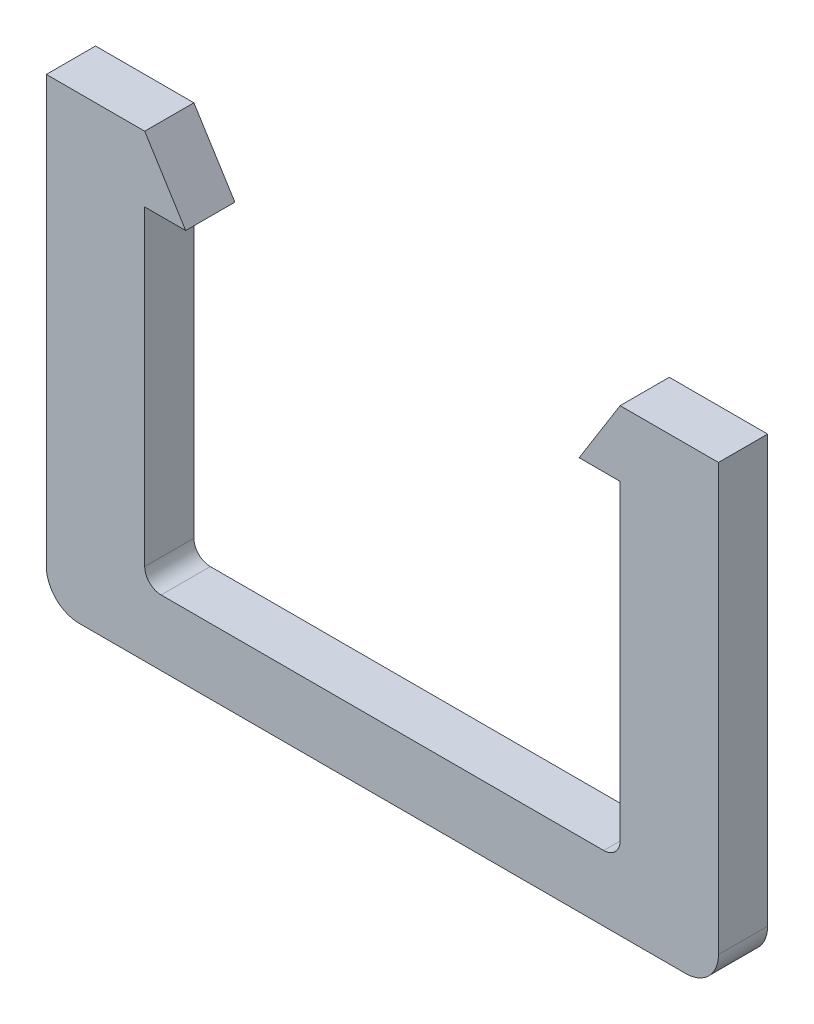
ISO-10303-21;
HEADER;
FILE_DESCRIPTION(('STEP AP214'),'2;1');
FILE_NAME('part.step','',(''),(''),'','','');
FILE_SCHEMA(('AUTOMOTIVE_DESIGN { 1 0 10303 214 1 1 1 1 }'));
ENDSEC;
DATA;
#1=APPLICATION_CONTEXT('core data for automotive mechanical design processes');
#2=APPLICATION_PROTOCOL_DEFINITION('international standard','automotive_design',2000,#1);
#3=PRODUCT_CONTEXT('',#1,'mechanical');
#4=PRODUCT('Part','Part','',(#3));
#5=PRODUCT_RELATED_PRODUCT_CATEGORY('part','',(#4));
#6=PRODUCT_DEFINITION_FORMATION('','',#4);
#7=PRODUCT_DEFINITION_CONTEXT('part definition',#1,'design');
#8=PRODUCT_DEFINITION('design','',#6,#7);
#9=PRODUCT_DEFINITION_SHAPE('','',#8);
#10=(LENGTH_UNIT() NAMED_UNIT(*) SI_UNIT(.MILLI.,.METRE.));
#11=(NAMED_UNIT(*) PLANE_ANGLE_UNIT() SI_UNIT($,.RADIAN.));
#12=(NAMED_UNIT(*) SI_UNIT($,.STERADIAN.) SOLID_ANGLE_UNIT());
#13=UNCERTAINTY_MEASURE_WITH_UNIT(LENGTH_MEASURE(1.E-05),#10,'distance_accuracy_value','');
#14=(GEOMETRIC_REPRESENTATION_CONTEXT(3) GLOBAL_UNCERTAINTY_ASSIGNED_CONTEXT((#13)) GLOBAL_UNIT_ASSIGNED_CONTEXT((#10,
#11,#12)) REPRESENTATION_CONTEXT('',''));
#15=CARTESIAN_POINT('',(0.,0.,0.));
#16=DIRECTION('',(0.,0.,1.));
#17=DIRECTION('',(1.,0.,0.));
#18=AXIS2_PLACEMENT_3D('',#15,#16,#17);
#19=CARTESIAN_POINT('',(-14.5,24.,1.5));
#20=DIRECTION('',(0.,1.,0.));
#21=DIRECTION('',(-1.,0.,0.));
#22=AXIS2_PLACEMENT_3D('',#19,#20,#21);
#23=PLANE('',#22);
#24=DIRECTION('',(1.,0.,0.));
#25=VECTOR('',#24,1.);
#26=CARTESIAN_POINT('',(-14.5,24.,-1.5));
#27=LINE('',#26,#25);
#28=CARTESIAN_POINT('',(-14.5,24.,-1.5));
#29=VERTEX_POINT('',#28);
#30=CARTESIAN_POINT('',(-12.,24.,-1.5));
#31=VERTEX_POINT('',#30);
#32=EDGE_CURVE('E188',#29,#31,#27,.T.);
#33=ORIENTED_EDGE('',*,*,#32,.T.);
#34=DIRECTION('',(0.,0.,-1.));
#35=VECTOR('',#34,1.);
#36=CARTESIAN_POINT('',(-12.,24.,1.5));
#37=LINE('',#36,#35);
#38=CARTESIAN_POINT('',(-12.,24.,1.5));
#39=VERTEX_POINT('',#38);
#40=EDGE_CURVE('E11',#39,#31,#37,.T.);
#41=ORIENTED_EDGE('',*,*,#40,.F.);
#42=DIRECTION('',(1.,0.,0.));
#43=VECTOR('',#42,1.);
#44=CARTESIAN_POINT('',(-14.5,24.,1.5));
#45=LINE('',#44,#43);
#46=CARTESIAN_POINT('',(-14.5,24.,1.5));
#47=VERTEX_POINT('',#46);
#48=EDGE_CURVE('E234',#47,#39,#45,.T.);
#49=ORIENTED_EDGE('',*,*,#48,.F.);
#50=DIRECTION('',(0.,0.,-1.));
#51=VECTOR('',#50,1.);
#52=CARTESIAN_POINT('',(-14.5,24.,1.5));
#53=LINE('',#52,#51);
#54=EDGE_CURVE('E184',#47,#29,#53,.T.);
#55=ORIENTED_EDGE('',*,*,#54,.T.);
#56=EDGE_LOOP('',(#33,#41,#49,#55));
#57=FACE_BOUND('',#56,.T.);
#58=ADVANCED_FACE('F39',(#57),#23,.F.);
#59=CARTESIAN_POINT('',(-14.5,28.,1.5));
#60=DIRECTION('',(-0.847998304005089,-0.529998940003179,0.));
#61=DIRECTION('',(0.529998940003179,-0.847998304005089,0.));
#62=AXIS2_PLACEMENT_3D('',#59,#60,#61);
#63=PLANE('',#62);
#64=DIRECTION('',(-0.529998940003179,0.847998304005089,0.));
#65=VECTOR('',#64,1.);
#66=CARTESIAN_POINT('',(-14.5,28.,-1.5));
#67=LINE('',#66,#65);
#68=CARTESIAN_POINT('',(-14.5,28.,-1.5));
#69=VERTEX_POINT('',#68);
#70=EDGE_CURVE('E192',#31,#69,#67,.T.);
#71=ORIENTED_EDGE('',*,*,#70,.T.);
#72=DIRECTION('',(0.,0.,-1.));
#73=VECTOR('',#72,1.);
#74=CARTESIAN_POINT('',(-14.5,28.,1.5));
#75=LINE('',#74,#73);
#76=CARTESIAN_POINT('',(-14.5,28.,1.5));
#77=VERTEX_POINT('',#76);
#78=EDGE_CURVE('E48',#77,#69,#75,.T.);
#79=ORIENTED_EDGE('',*,*,#78,.F.);
#80=DIRECTION('',(-0.529998940003179,0.847998304005089,0.));
#81=VECTOR('',#80,1.);
#82=CARTESIAN_POINT('',(-14.5,28.,1.5));
#83=LINE('',#82,#81);
#84=EDGE_CURVE('E123',#39,#77,#83,.T.);
#85=ORIENTED_EDGE('',*,*,#84,.F.);
#86=ORIENTED_EDGE('',*,*,#40,.T.);
#87=EDGE_LOOP('',(#71,#79,#85,#86));
#88=FACE_BOUND('',#87,.T.);
#89=ADVANCED_FACE('F356',(#88),#63,.F.);
#90=CARTESIAN_POINT('',(-20.5,28.,1.5));
#91=DIRECTION('',(0.,-1.,0.));
#92=DIRECTION('',(1.,0.,0.));
#93=AXIS2_PLACEMENT_3D('',#90,#91,#92);
#94=PLANE('',#93);
#95=DIRECTION('',(-1.,0.,0.));
#96=VECTOR('',#95,1.);
#97=CARTESIAN_POINT('',(-20.5,28.,-1.5));
#98=LINE('',#97,#96);
#99=CARTESIAN_POINT('',(-20.5,28.,-1.5));
#100=VERTEX_POINT('',#99);
#101=EDGE_CURVE('E195',#69,#100,#98,.T.);
#102=ORIENTED_EDGE('',*,*,#101,.T.);
#103=DIRECTION('',(0.,0.,-1.));
#104=VECTOR('',#103,1.);
#105=CARTESIAN_POINT('',(-20.5,28.,1.5));
#106=LINE('',#105,#104);
#107=CARTESIAN_POINT('',(-20.5,28.,1.5));
#108=VERTEX_POINT('',#107);
#109=EDGE_CURVE('E277',#108,#100,#106,.T.);
#110=ORIENTED_EDGE('',*,*,#109,.F.);
#111=DIRECTION('',(-1.,0.,0.));
#112=VECTOR('',#111,1.);
#113=CARTESIAN_POINT('',(-20.5,28.,1.5));
#114=LINE('',#113,#112);
#115=EDGE_CURVE('E287',#77,#108,#114,.T.);
#116=ORIENTED_EDGE('',*,*,#115,.F.);
#117=ORIENTED_EDGE('',*,*,#78,.T.);
#118=EDGE_LOOP('',(#102,#110,#116,#117));
#119=FACE_BOUND('',#118,.T.);
#120=ADVANCED_FACE('F285',(#119),#94,.F.);
#121=CARTESIAN_POINT('',(-20.5,2.00000000000001,1.5));
#122=DIRECTION('',(1.,0.,0.));
#123=DIRECTION('',(0.,0.,-1.));
#124=AXIS2_PLACEMENT_3D('',#121,#122,#123);
#125=PLANE('',#124);
#126=DIRECTION('',(0.,-1.,0.));
#127=VECTOR('',#126,1.);
#128=CARTESIAN_POINT('',(-20.5,2.00000000000001,-1.5));
#129=LINE('',#128,#127);
#130=CARTESIAN_POINT('',(-20.5,2.,-1.5));
#131=VERTEX_POINT('',#130);
#132=EDGE_CURVE('E198',#100,#131,#129,.T.);
#133=ORIENTED_EDGE('',*,*,#132,.T.);
#134=DIRECTION('',(0.,0.,-1.));
#135=VECTOR('',#134,1.);
#136=CARTESIAN_POINT('',(-20.5,2.,1.5));
#137=LINE('',#136,#135);
#138=CARTESIAN_POINT('',(-20.5,2.,1.5));
#139=VERTEX_POINT('',#138);
#140=EDGE_CURVE('E273',#139,#131,#137,.T.);
#141=ORIENTED_EDGE('',*,*,#140,.F.);
#142=DIRECTION('',(0.,-1.,0.));
#143=VECTOR('',#142,1.);
#144=CARTESIAN_POINT('',(-20.5,2.00000000000001,1.5));
#145=LINE('',#144,#143);
#146=EDGE_CURVE('E306',#108,#139,#145,.T.);
#147=ORIENTED_EDGE('',*,*,#146,.F.);
#148=ORIENTED_EDGE('',*,*,#109,.T.);
#149=EDGE_LOOP('',(#133,#141,#147,#148));
#150=FACE_BOUND('',#149,.T.);
#151=ADVANCED_FACE('F296',(#150),#125,.F.);
#152=CARTESIAN_POINT('',(-18.5,2.,1.5));
#153=DIRECTION('',(0.,0.,-1.));
#154=DIRECTION('',(-1.,0.,0.));
#155=AXIS2_PLACEMENT_3D('',#152,#153,#154);
#156=CYLINDRICAL_SURFACE('',#155,2.);
#157=CARTESIAN_POINT('',(-18.5,2.,-1.5));
#158=DIRECTION('',(0.,0.,1.));
#159=DIRECTION('',(-1.,0.,0.));
#160=AXIS2_PLACEMENT_3D('',#157,#158,#159);
#161=CIRCLE('',#160,2.);
#162=CARTESIAN_POINT('',(-18.5,0.,-1.5));
#163=VERTEX_POINT('',#162);
#164=EDGE_CURVE('E201',#131,#163,#161,.T.);
#165=ORIENTED_EDGE('',*,*,#164,.T.);
#166=DIRECTION('',(0.,0.,-1.));
#167=VECTOR('',#166,1.);
#168=CARTESIAN_POINT('',(-18.5,0.,1.5));
#169=LINE('',#168,#167);
#170=CARTESIAN_POINT('',(-18.5,0.,1.5));
#171=VERTEX_POINT('',#170);
#172=EDGE_CURVE('E269',#171,#163,#169,.T.);
#173=ORIENTED_EDGE('',*,*,#172,.F.);
#174=CARTESIAN_POINT('',(-18.5,2.,1.5));
#175=DIRECTION('',(0.,0.,1.));
#176=DIRECTION('',(-1.,0.,0.));
#177=AXIS2_PLACEMENT_3D('',#174,#175,#176);
#178=CIRCLE('',#177,2.);
#179=EDGE_CURVE('E302',#139,#171,#178,.T.);
#180=ORIENTED_EDGE('',*,*,#179,.F.);
#181=ORIENTED_EDGE('',*,*,#140,.T.);
#182=EDGE_LOOP('',(#165,#173,#180,#181));
#183=FACE_BOUND('',#182,.T.);
#184=ADVANCED_FACE('F300',(#183),#156,.T.);
#185=CARTESIAN_POINT('',(-18.5,0.,1.5));
#186=DIRECTION('',(0.,1.,0.));
#187=DIRECTION('',(0.,0.,1.));
#188=AXIS2_PLACEMENT_3D('',#185,#186,#187);
#189=PLANE('',#188);
#190=DIRECTION('',(1.,0.,0.));
#191=VECTOR('',#190,1.);
#192=CARTESIAN_POINT('',(-18.5,0.,-1.5));
#193=LINE('',#192,#191);
#194=CARTESIAN_POINT('',(18.5,0.,-1.5));
#195=VERTEX_POINT('',#194);
#196=EDGE_CURVE('E204',#163,#195,#193,.T.);
#197=ORIENTED_EDGE('',*,*,#196,.T.);
#198=DIRECTION('',(0.,0.,-1.));
#199=VECTOR('',#198,1.);
#200=CARTESIAN_POINT('',(18.5,0.,1.5));
#201=LINE('',#200,#199);
#202=CARTESIAN_POINT('',(18.5,0.,1.5));
#203=VERTEX_POINT('',#202);
#204=EDGE_CURVE('E265',#203,#195,#201,.T.);
#205=ORIENTED_EDGE('',*,*,#204,.F.);
#206=DIRECTION('',(1.,0.,0.));
#207=VECTOR('',#206,1.);
#208=CARTESIAN_POINT('',(-18.5,0.,1.5));
#209=LINE('',#208,#207);
#210=EDGE_CURVE('E305',#171,#203,#209,.T.);
#211=ORIENTED_EDGE('',*,*,#210,.F.);
#212=ORIENTED_EDGE('',*,*,#172,.T.);
#213=EDGE_LOOP('',(#197,#205,#211,#212));
#214=FACE_BOUND('',#213,.T.);
#215=ADVANCED_FACE('F369',(#214),#189,.F.);
#216=CARTESIAN_POINT('',(18.5,2.,1.5));
#217=DIRECTION('',(0.,0.,-1.));
#218=DIRECTION('',(-1.,0.,0.));
#219=AXIS2_PLACEMENT_3D('',#216,#217,#218);
#220=CYLINDRICAL_SURFACE('',#219,2.);
#221=CARTESIAN_POINT('',(18.5,2.,-1.5));
#222=DIRECTION('',(0.,0.,1.));
#223=DIRECTION('',(-1.,0.,0.));
#224=AXIS2_PLACEMENT_3D('',#221,#222,#223);
#225=CIRCLE('',#224,2.);
#226=CARTESIAN_POINT('',(20.5,2.00000000000001,-1.5));
#227=VERTEX_POINT('',#226);
#228=EDGE_CURVE('E207',#195,#227,#225,.T.);
#229=ORIENTED_EDGE('',*,*,#228,.T.);
#230=DIRECTION('',(0.,0.,-1.));
#231=VECTOR('',#230,1.);
#232=CARTESIAN_POINT('',(20.5,2.00000000000001,1.5));
#233=LINE('',#232,#231);
#234=CARTESIAN_POINT('',(20.5,2.00000000000001,1.5));
#235=VERTEX_POINT('',#234);
#236=EDGE_CURVE('E261',#235,#227,#233,.T.);
#237=ORIENTED_EDGE('',*,*,#236,.F.);
#238=CARTESIAN_POINT('',(18.5,2.,1.5));
#239=DIRECTION('',(0.,0.,1.));
#240=DIRECTION('',(-1.,0.,0.));
#241=AXIS2_PLACEMENT_3D('',#238,#239,#240);
#242=CIRCLE('',#241,2.);
#243=EDGE_CURVE('E310',#203,#235,#242,.T.);
#244=ORIENTED_EDGE('',*,*,#243,.F.);
#245=ORIENTED_EDGE('',*,*,#204,.T.);
#246=EDGE_LOOP('',(#229,#237,#244,#245));
#247=FACE_BOUND('',#246,.T.);
#248=ADVANCED_FACE('F372',(#247),#220,.T.);
#249=CARTESIAN_POINT('',(20.5,2.00000000000001,1.5));
#250=DIRECTION('',(-1.,0.,0.));
#251=DIRECTION('',(0.,0.,1.));
#252=AXIS2_PLACEMENT_3D('',#249,#250,#251);
#253=PLANE('',#252);
#254=DIRECTION('',(0.,1.,0.));
#255=VECTOR('',#254,1.);
#256=CARTESIAN_POINT('',(20.5,2.00000000000001,-1.5));
#257=LINE('',#256,#255);
#258=CARTESIAN_POINT('',(20.5,28.,-1.5));
#259=VERTEX_POINT('',#258);
#260=EDGE_CURVE('E210',#227,#259,#257,.T.);
#261=ORIENTED_EDGE('',*,*,#260,.T.);
#262=DIRECTION('',(0.,0.,-1.));
#263=VECTOR('',#262,1.);
#264=CARTESIAN_POINT('',(20.5,28.,1.5));
#265=LINE('',#264,#263);
#266=CARTESIAN_POINT('',(20.5,28.,1.5));
#267=VERTEX_POINT('',#266);
#268=EDGE_CURVE('E257',#267,#259,#265,.T.);
#269=ORIENTED_EDGE('',*,*,#268,.F.);
#270=DIRECTION('',(0.,1.,0.));
#271=VECTOR('',#270,1.);
#272=CARTESIAN_POINT('',(20.5,2.00000000000001,1.5));
#273=LINE('',#272,#271);
#274=EDGE_CURVE('E317',#235,#267,#273,.T.);
#275=ORIENTED_EDGE('',*,*,#274,.F.);
#276=ORIENTED_EDGE('',*,*,#236,.T.);
#277=EDGE_LOOP('',(#261,#269,#275,#276));
#278=FACE_BOUND('',#277,.T.);
#279=ADVANCED_FACE('F376',(#278),#253,.F.);
#280=CARTESIAN_POINT('',(20.5,28.,1.5));
#281=DIRECTION('',(0.,-1.,0.));
#282=DIRECTION('',(0.,0.,-1.));
#283=AXIS2_PLACEMENT_3D('',#280,#281,#282);
#284=PLANE('',#283);
#285=DIRECTION('',(-1.,0.,0.));
#286=VECTOR('',#285,1.);
#287=CARTESIAN_POINT('',(20.5,28.,-1.5));
#288=LINE('',#287,#286);
#289=CARTESIAN_POINT('',(14.5,28.,-1.5));
#290=VERTEX_POINT('',#289);
#291=EDGE_CURVE('E213',#259,#290,#288,.T.);
#292=ORIENTED_EDGE('',*,*,#291,.T.);
#293=DIRECTION('',(0.,0.,-1.));
#294=VECTOR('',#293,1.);
#295=CARTESIAN_POINT('',(14.5,28.,1.5));
#296=LINE('',#295,#294);
#297=CARTESIAN_POINT('',(14.5,28.,1.5));
#298=VERTEX_POINT('',#297);
#299=EDGE_CURVE('E253',#298,#290,#296,.T.);
#300=ORIENTED_EDGE('',*,*,#299,.F.);
#301=DIRECTION('',(-1.,0.,0.));
#302=VECTOR('',#301,1.);
#303=CARTESIAN_POINT('',(20.5,28.,1.5));
#304=LINE('',#303,#302);
#305=EDGE_CURVE('E320',#267,#298,#304,.T.);
#306=ORIENTED_EDGE('',*,*,#305,.F.);
#307=ORIENTED_EDGE('',*,*,#268,.T.);
#308=EDGE_LOOP('',(#292,#300,#306,#307));
#309=FACE_BOUND('',#308,.T.);
#310=ADVANCED_FACE('F380',(#309),#284,.F.);
#311=CARTESIAN_POINT('',(12.,24.,1.5));
#312=DIRECTION('',(0.847998304005089,-0.529998940003179,0.));
#313=DIRECTION('',(0.529998940003179,0.847998304005089,0.));
#314=AXIS2_PLACEMENT_3D('',#311,#312,#313);
#315=PLANE('',#314);
#316=DIRECTION('',(-0.529998940003179,-0.847998304005089,0.));
#317=VECTOR('',#316,1.);
#318=CARTESIAN_POINT('',(12.,24.,-1.5));
#319=LINE('',#318,#317);
#320=CARTESIAN_POINT('',(12.,24.,-1.5));
#321=VERTEX_POINT('',#320);
#322=EDGE_CURVE('E216',#290,#321,#319,.T.);
#323=ORIENTED_EDGE('',*,*,#322,.T.);
#324=DIRECTION('',(0.,0.,-1.));
#325=VECTOR('',#324,1.);
#326=CARTESIAN_POINT('',(12.,24.,1.5));
#327=LINE('',#326,#325);
#328=CARTESIAN_POINT('',(12.,24.,1.5));
#329=VERTEX_POINT('',#328);
#330=EDGE_CURVE('E249',#329,#321,#327,.T.);
#331=ORIENTED_EDGE('',*,*,#330,.F.);
#332=DIRECTION('',(-0.529998940003179,-0.847998304005089,0.));
#333=VECTOR('',#332,1.);
#334=CARTESIAN_POINT('',(12.,24.,1.5));
#335=LINE('',#334,#333);
#336=EDGE_CURVE('E323',#298,#329,#335,.T.);
#337=ORIENTED_EDGE('',*,*,#336,.F.);
#338=ORIENTED_EDGE('',*,*,#299,.T.);
#339=EDGE_LOOP('',(#323,#331,#337,#338));
#340=FACE_BOUND('',#339,.T.);
#341=ADVANCED_FACE('F384',(#340),#315,.F.);
#342=CARTESIAN_POINT('',(14.5,24.,1.5));
#343=DIRECTION('',(0.,1.,0.));
#344=DIRECTION('',(0.,0.,1.));
#345=AXIS2_PLACEMENT_3D('',#342,#343,#344);
#346=PLANE('',#345);
#347=DIRECTION('',(1.,0.,0.));
#348=VECTOR('',#347,1.);
#349=CARTESIAN_POINT('',(14.5,24.,-1.5));
#350=LINE('',#349,#348);
#351=CARTESIAN_POINT('',(14.5,24.,-1.5));
#352=VERTEX_POINT('',#351);
#353=EDGE_CURVE('E219',#321,#352,#350,.T.);
#354=ORIENTED_EDGE('',*,*,#353,.T.);
#355=DIRECTION('',(0.,0.,-1.));
#356=VECTOR('',#355,1.);
#357=CARTESIAN_POINT('',(14.5,24.,1.5));
#358=LINE('',#357,#356);
#359=CARTESIAN_POINT('',(14.5,24.,1.5));
#360=VERTEX_POINT('',#359);
#361=EDGE_CURVE('E245',#360,#352,#358,.T.);
#362=ORIENTED_EDGE('',*,*,#361,.F.);
#363=DIRECTION('',(1.,0.,0.));
#364=VECTOR('',#363,1.);
#365=CARTESIAN_POINT('',(14.5,24.,1.5));
#366=LINE('',#365,#364);
#367=EDGE_CURVE('E326',#329,#360,#366,.T.);
#368=ORIENTED_EDGE('',*,*,#367,.F.);
#369=ORIENTED_EDGE('',*,*,#330,.T.);
#370=EDGE_LOOP('',(#354,#362,#368,#369));
#371=FACE_BOUND('',#370,.T.);
#372=ADVANCED_FACE('F388',(#371),#346,.F.);
#373=CARTESIAN_POINT('',(14.5,5.,1.5));
#374=DIRECTION('',(1.,0.,0.));
#375=DIRECTION('',(0.,0.,-1.));
#376=AXIS2_PLACEMENT_3D('',#373,#374,#375);
#377=PLANE('',#376);
#378=DIRECTION('',(0.,-1.,0.));
#379=VECTOR('',#378,1.);
#380=CARTESIAN_POINT('',(14.5,5.,-1.5));
#381=LINE('',#380,#379);
#382=CARTESIAN_POINT('',(14.5,5.,-1.5));
#383=VERTEX_POINT('',#382);
#384=EDGE_CURVE('E222',#352,#383,#381,.T.);
#385=ORIENTED_EDGE('',*,*,#384,.T.);
#386=DIRECTION('',(0.,0.,-1.));
#387=VECTOR('',#386,1.);
#388=CARTESIAN_POINT('',(14.5,5.,1.5));
#389=LINE('',#388,#387);
#390=CARTESIAN_POINT('',(14.5,5.,1.5));
#391=VERTEX_POINT('',#390);
#392=EDGE_CURVE('E241',#391,#383,#389,.T.);
#393=ORIENTED_EDGE('',*,*,#392,.F.);
#394=DIRECTION('',(0.,-1.,0.));
#395=VECTOR('',#394,1.);
#396=CARTESIAN_POINT('',(14.5,5.,1.5));
#397=LINE('',#396,#395);
#398=EDGE_CURVE('E329',#360,#391,#397,.T.);
#399=ORIENTED_EDGE('',*,*,#398,.F.);
#400=ORIENTED_EDGE('',*,*,#361,.T.);
#401=EDGE_LOOP('',(#385,#393,#399,#400));
#402=FACE_BOUND('',#401,.T.);
#403=ADVANCED_FACE('F337',(#402),#377,.F.);
#404=CARTESIAN_POINT('',(13.5,5.,1.5));
#405=DIRECTION('',(0.,0.,-1.));
#406=DIRECTION('',(-1.,0.,0.));
#407=AXIS2_PLACEMENT_3D('',#404,#405,#406);
#408=CYLINDRICAL_SURFACE('',#407,1.);
#409=CARTESIAN_POINT('',(13.5,5.,-1.5));
#410=DIRECTION('',(0.,0.,-1.));
#411=DIRECTION('',(-1.,0.,0.));
#412=AXIS2_PLACEMENT_3D('',#409,#410,#411);
#413=CIRCLE('',#412,1.);
#414=CARTESIAN_POINT('',(13.5,4.,-1.5));
#415=VERTEX_POINT('',#414);
#416=EDGE_CURVE('E225',#383,#415,#413,.T.);
#417=ORIENTED_EDGE('',*,*,#416,.T.);
#418=DIRECTION('',(0.,0.,-1.));
#419=VECTOR('',#418,1.);
#420=CARTESIAN_POINT('',(13.5,4.,1.5));
#421=LINE('',#420,#419);
#422=CARTESIAN_POINT('',(13.5,4.,1.5));
#423=VERTEX_POINT('',#422);
#424=EDGE_CURVE('E177',#423,#415,#421,.T.);
#425=ORIENTED_EDGE('',*,*,#424,.F.);
#426=CARTESIAN_POINT('',(13.5,5.,1.5));
#427=DIRECTION('',(0.,0.,-1.));
#428=DIRECTION('',(-1.,0.,0.));
#429=AXIS2_PLACEMENT_3D('',#426,#427,#428);
#430=CIRCLE('',#429,1.);
#431=EDGE_CURVE('E166',#391,#423,#430,.T.);
#432=ORIENTED_EDGE('',*,*,#431,.F.);
#433=ORIENTED_EDGE('',*,*,#392,.T.);
#434=EDGE_LOOP('',(#417,#425,#432,#433));
#435=FACE_BOUND('',#434,.T.);
#436=ADVANCED_FACE('F341',(#435),#408,.F.);
#437=CARTESIAN_POINT('',(-13.5,4.,1.5));
#438=DIRECTION('',(0.,-1.,0.));
#439=DIRECTION('',(1.,0.,0.));
#440=AXIS2_PLACEMENT_3D('',#437,#438,#439);
#441=PLANE('',#440);
#442=DIRECTION('',(-1.,0.,0.));
#443=VECTOR('',#442,1.);
#444=CARTESIAN_POINT('',(-13.5,4.,-1.5));
#445=LINE('',#444,#443);
#446=CARTESIAN_POINT('',(-13.5,4.,-1.5));
#447=VERTEX_POINT('',#446);
#448=EDGE_CURVE('E175',#415,#447,#445,.T.);
#449=ORIENTED_EDGE('',*,*,#448,.T.);
#450=DIRECTION('',(0.,0.,-1.));
#451=VECTOR('',#450,1.);
#452=CARTESIAN_POINT('',(-13.5,4.,1.5));
#453=LINE('',#452,#451);
#454=CARTESIAN_POINT('',(-13.5,4.,1.5));
#455=VERTEX_POINT('',#454);
#456=EDGE_CURVE('E172',#455,#447,#453,.T.);
#457=ORIENTED_EDGE('',*,*,#456,.F.);
#458=DIRECTION('',(-1.,0.,0.));
#459=VECTOR('',#458,1.);
#460=CARTESIAN_POINT('',(-13.5,4.,1.5));
#461=LINE('',#460,#459);
#462=EDGE_CURVE('E160',#423,#455,#461,.T.);
#463=ORIENTED_EDGE('',*,*,#462,.F.);
#464=ORIENTED_EDGE('',*,*,#424,.T.);
#465=EDGE_LOOP('',(#449,#457,#463,#464));
#466=FACE_BOUND('',#465,.T.);
#467=ADVANCED_FACE('F173',(#466),#441,.F.);
#468=CARTESIAN_POINT('',(-13.5,5.,1.5));
#469=DIRECTION('',(0.,0.,-1.));
#470=DIRECTION('',(-1.,0.,0.));
#471=AXIS2_PLACEMENT_3D('',#468,#469,#470);
#472=CYLINDRICAL_SURFACE('',#471,0.999999999999998);
#473=CARTESIAN_POINT('',(-13.5,5.,-1.5));
#474=DIRECTION('',(0.,0.,-1.));
#475=DIRECTION('',(-1.,0.,0.));
#476=AXIS2_PLACEMENT_3D('',#473,#474,#475);
#477=CIRCLE('',#476,0.999999999999998);
#478=CARTESIAN_POINT('',(-14.5,5.,-1.5));
#479=VERTEX_POINT('',#478);
#480=EDGE_CURVE('E109',#447,#479,#477,.T.);
#481=ORIENTED_EDGE('',*,*,#480,.T.);
#482=DIRECTION('',(0.,0.,-1.));
#483=VECTOR('',#482,1.);
#484=CARTESIAN_POINT('',(-14.5,5.,1.5));
#485=LINE('',#484,#483);
#486=CARTESIAN_POINT('',(-14.5,5.,1.5));
#487=VERTEX_POINT('',#486);
#488=EDGE_CURVE('E178',#487,#479,#485,.T.);
#489=ORIENTED_EDGE('',*,*,#488,.F.);
#490=CARTESIAN_POINT('',(-13.5,5.,1.5));
#491=DIRECTION('',(0.,0.,-1.));
#492=DIRECTION('',(-1.,0.,0.));
#493=AXIS2_PLACEMENT_3D('',#490,#491,#492);
#494=CIRCLE('',#493,0.999999999999998);
#495=EDGE_CURVE('E164',#455,#487,#494,.T.);
#496=ORIENTED_EDGE('',*,*,#495,.F.);
#497=ORIENTED_EDGE('',*,*,#456,.T.);
#498=EDGE_LOOP('',(#481,#489,#496,#497));
#499=FACE_BOUND('',#498,.T.);
#500=ADVANCED_FACE('F180',(#499),#472,.F.);
#501=CARTESIAN_POINT('',(-14.5,24.,1.5));
#502=DIRECTION('',(-1.,0.,0.));
#503=DIRECTION('',(0.,0.,1.));
#504=AXIS2_PLACEMENT_3D('',#501,#502,#503);
#505=PLANE('',#504);
#506=DIRECTION('',(0.,1.,0.));
#507=VECTOR('',#506,1.);
#508=CARTESIAN_POINT('',(-14.5,24.,-1.5));
#509=LINE('',#508,#507);
#510=EDGE_CURVE('E115',#479,#29,#509,.T.);
#511=ORIENTED_EDGE('',*,*,#510,.T.);
#512=ORIENTED_EDGE('',*,*,#54,.F.);
#513=DIRECTION('',(0.,1.,0.));
#514=VECTOR('',#513,1.);
#515=CARTESIAN_POINT('',(-14.5,24.,1.5));
#516=LINE('',#515,#514);
#517=EDGE_CURVE('E56',#487,#47,#516,.T.);
#518=ORIENTED_EDGE('',*,*,#517,.F.);
#519=ORIENTED_EDGE('',*,*,#488,.T.);
#520=EDGE_LOOP('',(#511,#512,#518,#519));
#521=FACE_BOUND('',#520,.T.);
#522=ADVANCED_FACE('F345',(#521),#505,.F.);
#523=CARTESIAN_POINT('',(-18.5,2.,1.5));
#524=DIRECTION('',(0.,0.,-1.));
#525=DIRECTION('',(-1.,0.,0.));
#526=AXIS2_PLACEMENT_3D('',#523,#524,#525);
#527=PLANE('',#526);
#528=ORIENTED_EDGE('',*,*,#48,.T.);
#529=ORIENTED_EDGE('',*,*,#84,.T.);
#530=ORIENTED_EDGE('',*,*,#115,.T.);
#531=ORIENTED_EDGE('',*,*,#146,.T.);
#532=ORIENTED_EDGE('',*,*,#179,.T.);
#533=ORIENTED_EDGE('',*,*,#210,.T.);
#534=ORIENTED_EDGE('',*,*,#243,.T.);
#535=ORIENTED_EDGE('',*,*,#274,.T.);
#536=ORIENTED_EDGE('',*,*,#305,.T.);
#537=ORIENTED_EDGE('',*,*,#336,.T.);
#538=ORIENTED_EDGE('',*,*,#367,.T.);
#539=ORIENTED_EDGE('',*,*,#398,.T.);
#540=ORIENTED_EDGE('',*,*,#431,.T.);
#541=ORIENTED_EDGE('',*,*,#462,.T.);
#542=ORIENTED_EDGE('',*,*,#495,.T.);
#543=ORIENTED_EDGE('',*,*,#517,.T.);
#544=EDGE_LOOP('',(#528,#529,#530,#531,#532,#533,#534,#535,#536,#537,#538,#539,#540,#541,#542,#543));
#545=FACE_BOUND('',#544,.T.);
#546=ADVANCED_FACE('F162',(#545),#527,.F.);
#547=CARTESIAN_POINT('',(-18.5,2.,-1.5));
#548=DIRECTION('',(0.,0.,-1.));
#549=DIRECTION('',(-1.,0.,0.));
#550=AXIS2_PLACEMENT_3D('',#547,#548,#549);
#551=PLANE('',#550);
#552=ORIENTED_EDGE('',*,*,#32,.F.);
#553=ORIENTED_EDGE('',*,*,#510,.F.);
#554=ORIENTED_EDGE('',*,*,#480,.F.);
#555=ORIENTED_EDGE('',*,*,#448,.F.);
#556=ORIENTED_EDGE('',*,*,#416,.F.);
#557=ORIENTED_EDGE('',*,*,#384,.F.);
#558=ORIENTED_EDGE('',*,*,#353,.F.);
#559=ORIENTED_EDGE('',*,*,#322,.F.);
#560=ORIENTED_EDGE('',*,*,#291,.F.);
#561=ORIENTED_EDGE('',*,*,#260,.F.);
#562=ORIENTED_EDGE('',*,*,#228,.F.);
#563=ORIENTED_EDGE('',*,*,#196,.F.);
#564=ORIENTED_EDGE('',*,*,#164,.F.);
#565=ORIENTED_EDGE('',*,*,#132,.F.);
#566=ORIENTED_EDGE('',*,*,#101,.F.);
#567=ORIENTED_EDGE('',*,*,#70,.F.);
#568=EDGE_LOOP('',(#552,#553,#554,#555,#556,#557,#558,#559,#560,#561,#562,#563,#564,#565,#566,#567));
#569=FACE_BOUND('',#568,.T.);
#570=ADVANCED_FACE('F291',(#569),#551,.T.);
#571=CLOSED_SHELL('',(#58,#89,#120,#151,#184,#215,#248,#279,#310,#341,#372,#403,#436,#467,#500,
#522,#546,#570));
#572=MANIFOLD_SOLID_BREP('B2',#571);
#573=ADVANCED_BREP_SHAPE_REPRESENTATION('',(#18,#572),#14);
#574=SHAPE_DEFINITION_REPRESENTATION(#9,#573);
ENDSEC;
END-ISO-10303-21;
